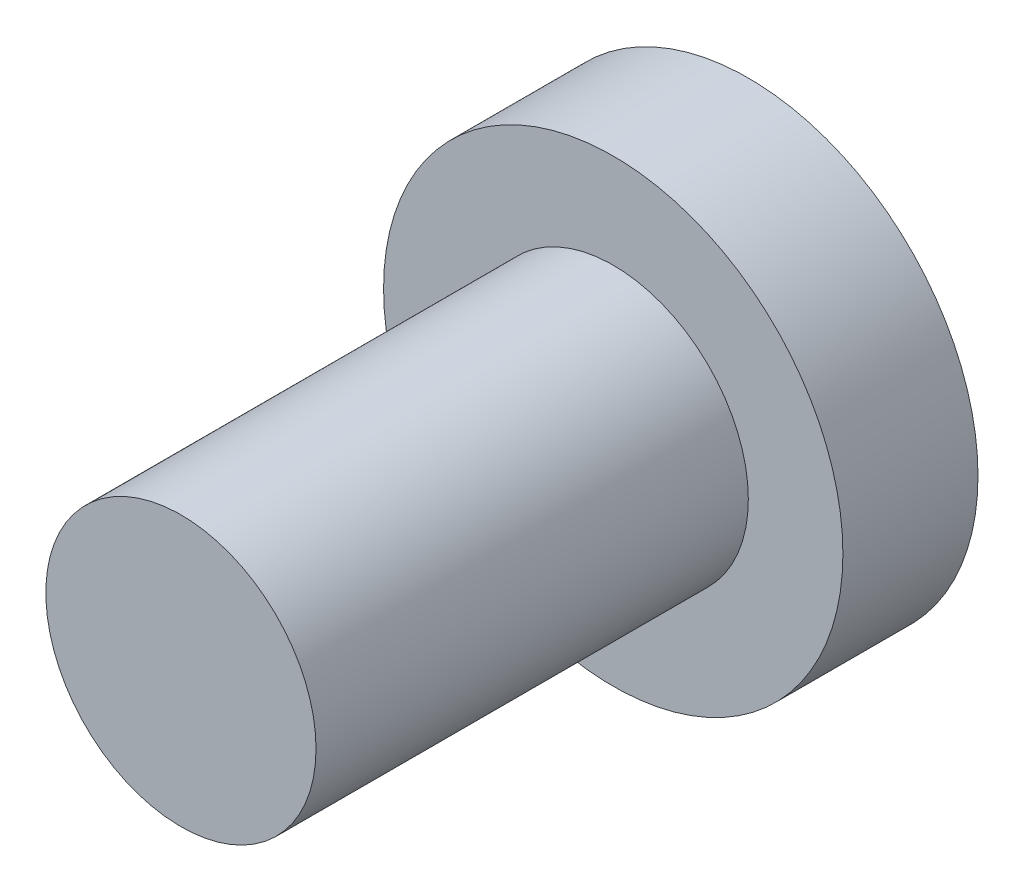
ISO-10303-21;
HEADER;
FILE_DESCRIPTION(('STEP AP214'),'2;1');
FILE_NAME('part.step','',(''),(''),'','','');
FILE_SCHEMA(('AUTOMOTIVE_DESIGN { 1 0 10303 214 1 1 1 1 }'));
ENDSEC;
DATA;
#1=APPLICATION_CONTEXT('core data for automotive mechanical design processes');
#2=APPLICATION_PROTOCOL_DEFINITION('international standard','automotive_design',2000,#1);
#3=PRODUCT_CONTEXT('',#1,'mechanical');
#4=PRODUCT('Part','Part','',(#3));
#5=PRODUCT_RELATED_PRODUCT_CATEGORY('part','',(#4));
#6=PRODUCT_DEFINITION_FORMATION('','',#4);
#7=PRODUCT_DEFINITION_CONTEXT('part definition',#1,'design');
#8=PRODUCT_DEFINITION('design','',#6,#7);
#9=PRODUCT_DEFINITION_SHAPE('','',#8);
#10=(LENGTH_UNIT() NAMED_UNIT(*) SI_UNIT(.MILLI.,.METRE.));
#11=(NAMED_UNIT(*) PLANE_ANGLE_UNIT() SI_UNIT($,.RADIAN.));
#12=(NAMED_UNIT(*) SI_UNIT($,.STERADIAN.) SOLID_ANGLE_UNIT());
#13=UNCERTAINTY_MEASURE_WITH_UNIT(LENGTH_MEASURE(1.E-05),#10,'distance_accuracy_value','');
#14=(GEOMETRIC_REPRESENTATION_CONTEXT(3) GLOBAL_UNCERTAINTY_ASSIGNED_CONTEXT((#13)) GLOBAL_UNIT_ASSIGNED_CONTEXT((#10,
#11,#12)) REPRESENTATION_CONTEXT('',''));
#15=CARTESIAN_POINT('',(0.,0.,0.));
#16=DIRECTION('',(0.,0.,1.));
#17=DIRECTION('',(1.,0.,0.));
#18=AXIS2_PLACEMENT_3D('',#15,#16,#17);
#19=CARTESIAN_POINT('',(0.,0.,0.));
#20=DIRECTION('',(0.,0.,1.));
#21=DIRECTION('',(1.,0.,0.));
#22=AXIS2_PLACEMENT_3D('',#19,#20,#21);
#23=PLANE('',#22);
#24=CARTESIAN_POINT('',(0.,0.,0.));
#25=DIRECTION('',(0.,0.,1.));
#26=DIRECTION('',(1.,0.,0.));
#27=AXIS2_PLACEMENT_3D('',#24,#25,#26);
#28=CIRCLE('',#27,4.25);
#29=CARTESIAN_POINT('',(4.25,0.,0.));
#30=VERTEX_POINT('',#29);
#31=EDGE_CURVE('E39',#30,#30,#28,.T.);
#32=ORIENTED_EDGE('',*,*,#31,.T.);
#33=EDGE_LOOP('',(#32));
#34=FACE_BOUND('',#33,.T.);
#35=CARTESIAN_POINT('',(0.,0.,0.));
#36=DIRECTION('',(0.,0.,1.));
#37=DIRECTION('',(1.,0.,0.));
#38=AXIS2_PLACEMENT_3D('',#35,#36,#37);
#39=CIRCLE('',#38,2.5);
#40=CARTESIAN_POINT('',(2.5,0.,0.));
#41=VERTEX_POINT('',#40);
#42=EDGE_CURVE('E48',#41,#41,#39,.T.);
#43=ORIENTED_EDGE('',*,*,#42,.F.);
#44=EDGE_LOOP('',(#43));
#45=FACE_BOUND('',#44,.T.);
#46=ADVANCED_FACE('F35',(#34,#45),#23,.T.);
#47=CARTESIAN_POINT('',(0.,0.,-2.5));
#48=DIRECTION('',(0.,0.,1.));
#49=DIRECTION('',(1.,0.,0.));
#50=AXIS2_PLACEMENT_3D('',#47,#48,#49);
#51=CYLINDRICAL_SURFACE('',#50,4.25);
#52=CARTESIAN_POINT('',(0.,0.,-2.5));
#53=DIRECTION('',(0.,0.,1.));
#54=DIRECTION('',(1.,0.,0.));
#55=AXIS2_PLACEMENT_3D('',#52,#53,#54);
#56=CIRCLE('',#55,4.25);
#57=CARTESIAN_POINT('',(4.25,0.,-2.5));
#58=VERTEX_POINT('',#57);
#59=EDGE_CURVE('E10',#58,#58,#56,.T.);
#60=ORIENTED_EDGE('',*,*,#59,.T.);
#61=EDGE_LOOP('',(#60));
#62=FACE_BOUND('',#61,.T.);
#63=ORIENTED_EDGE('',*,*,#31,.F.);
#64=EDGE_LOOP('',(#63));
#65=FACE_BOUND('',#64,.T.);
#66=ADVANCED_FACE('F37',(#62,#65),#51,.T.);
#67=CARTESIAN_POINT('',(0.,0.,-2.5));
#68=DIRECTION('',(0.,0.,1.));
#69=DIRECTION('',(1.,0.,0.));
#70=AXIS2_PLACEMENT_3D('',#67,#68,#69);
#71=PLANE('',#70);
#72=ORIENTED_EDGE('',*,*,#59,.F.);
#73=EDGE_LOOP('',(#72));
#74=FACE_BOUND('',#73,.T.);
#75=ADVANCED_FACE('F59',(#74),#71,.F.);
#76=CARTESIAN_POINT('',(0.,0.,8.));
#77=DIRECTION('',(0.,0.,-1.));
#78=DIRECTION('',(-1.,0.,0.));
#79=AXIS2_PLACEMENT_3D('',#76,#77,#78);
#80=CYLINDRICAL_SURFACE('',#79,2.5);
#81=CARTESIAN_POINT('',(0.,0.,8.));
#82=DIRECTION('',(0.,0.,1.));
#83=DIRECTION('',(1.,0.,0.));
#84=AXIS2_PLACEMENT_3D('',#81,#82,#83);
#85=CIRCLE('',#84,2.5);
#86=CARTESIAN_POINT('',(2.5,0.,8.));
#87=VERTEX_POINT('',#86);
#88=EDGE_CURVE('E46',#87,#87,#85,.T.);
#89=ORIENTED_EDGE('',*,*,#88,.F.);
#90=EDGE_LOOP('',(#89));
#91=FACE_BOUND('',#90,.T.);
#92=ORIENTED_EDGE('',*,*,#42,.T.);
#93=EDGE_LOOP('',(#92));
#94=FACE_BOUND('',#93,.T.);
#95=ADVANCED_FACE('F56',(#91,#94),#80,.T.);
#96=CARTESIAN_POINT('',(0.,0.,8.));
#97=DIRECTION('',(0.,0.,1.));
#98=DIRECTION('',(1.,0.,0.));
#99=AXIS2_PLACEMENT_3D('',#96,#97,#98);
#100=PLANE('',#99);
#101=ORIENTED_EDGE('',*,*,#88,.T.);
#102=EDGE_LOOP('',(#101));
#103=FACE_BOUND('',#102,.T.);
#104=ADVANCED_FACE('F54',(#103),#100,.T.);
#105=CLOSED_SHELL('',(#46,#66,#75,#95,#104));
#106=MANIFOLD_SOLID_BREP('B2',#105);
#107=ADVANCED_BREP_SHAPE_REPRESENTATION('',(#18,#106),#14);
#108=SHAPE_DEFINITION_REPRESENTATION(#9,#107);
ENDSEC;
END-ISO-10303-21;
